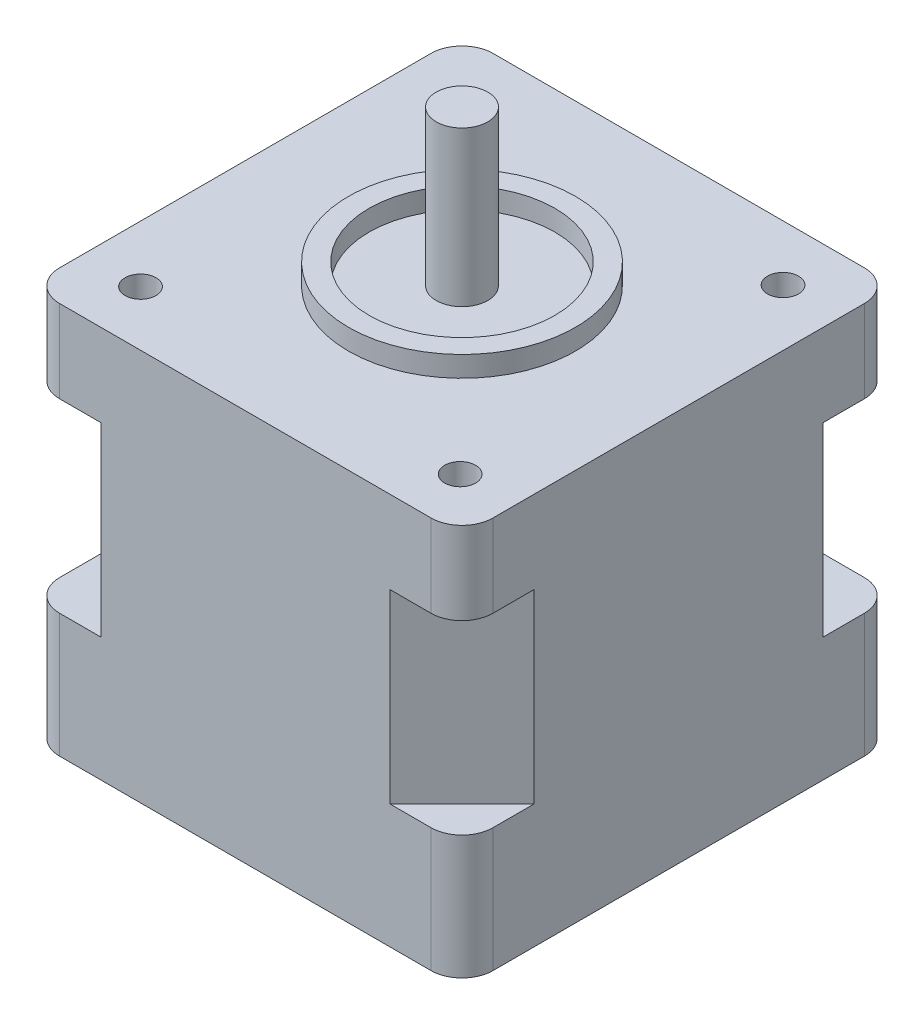
ISO-10303-21;
HEADER;
FILE_DESCRIPTION(('STEP AP214'),'2;1');
FILE_NAME('part.step','',(''),(''),'','','');
FILE_SCHEMA(('AUTOMOTIVE_DESIGN { 1 0 10303 214 1 1 1 1 }'));
ENDSEC;
DATA;
#1=APPLICATION_CONTEXT('core data for automotive mechanical design processes');
#2=APPLICATION_PROTOCOL_DEFINITION('international standard','automotive_design',2000,#1);
#3=PRODUCT_CONTEXT('',#1,'mechanical');
#4=PRODUCT('Part','Part','',(#3));
#5=PRODUCT_RELATED_PRODUCT_CATEGORY('part','',(#4));
#6=PRODUCT_DEFINITION_FORMATION('','',#4);
#7=PRODUCT_DEFINITION_CONTEXT('part definition',#1,'design');
#8=PRODUCT_DEFINITION('design','',#6,#7);
#9=PRODUCT_DEFINITION_SHAPE('','',#8);
#10=(LENGTH_UNIT() NAMED_UNIT(*) SI_UNIT(.MILLI.,.METRE.));
#11=(NAMED_UNIT(*) PLANE_ANGLE_UNIT() SI_UNIT($,.RADIAN.));
#12=(NAMED_UNIT(*) SI_UNIT($,.STERADIAN.) SOLID_ANGLE_UNIT());
#13=UNCERTAINTY_MEASURE_WITH_UNIT(LENGTH_MEASURE(1.E-05),#10,'distance_accuracy_value','');
#14=(GEOMETRIC_REPRESENTATION_CONTEXT(3) GLOBAL_UNCERTAINTY_ASSIGNED_CONTEXT((#13)) GLOBAL_UNIT_ASSIGNED_CONTEXT((#10,
#11,#12)) REPRESENTATION_CONTEXT('',''));
#15=CARTESIAN_POINT('',(0.,0.,0.));
#16=DIRECTION('',(0.,0.,1.));
#17=DIRECTION('',(1.,0.,0.));
#18=AXIS2_PLACEMENT_3D('',#15,#16,#17);
#19=CARTESIAN_POINT('',(-18.,12.,-21.));
#20=DIRECTION('',(0.,0.,1.));
#21=DIRECTION('',(1.,0.,0.));
#22=AXIS2_PLACEMENT_3D('',#19,#20,#21);
#23=PLANE('',#22);
#24=DIRECTION('',(-1.,0.,0.));
#25=VECTOR('',#24,1.);
#26=CARTESIAN_POINT('',(-18.,0.,-21.));
#27=LINE('',#26,#25);
#28=CARTESIAN_POINT('',(18.,0.,-21.));
#29=VERTEX_POINT('',#28);
#30=CARTESIAN_POINT('',(-18.,0.,-21.));
#31=VERTEX_POINT('',#30);
#32=EDGE_CURVE('E435',#29,#31,#27,.T.);
#33=ORIENTED_EDGE('',*,*,#32,.T.);
#34=DIRECTION('',(0.,-1.,0.));
#35=VECTOR('',#34,1.);
#36=CARTESIAN_POINT('',(-18.,12.,-21.));
#37=LINE('',#36,#35);
#38=CARTESIAN_POINT('',(-18.,12.,-21.));
#39=VERTEX_POINT('',#38);
#40=EDGE_CURVE('E445',#39,#31,#37,.T.);
#41=ORIENTED_EDGE('',*,*,#40,.F.);
#42=DIRECTION('',(-1.,0.,0.));
#43=VECTOR('',#42,1.);
#44=CARTESIAN_POINT('',(-18.,12.,-21.));
#45=LINE('',#44,#43);
#46=CARTESIAN_POINT('',(-14.,12.,-21.));
#47=VERTEX_POINT('',#46);
#48=EDGE_CURVE('E416',#47,#39,#45,.T.);
#49=ORIENTED_EDGE('',*,*,#48,.F.);
#50=DIRECTION('',(0.,-1.,0.));
#51=VECTOR('',#50,1.);
#52=CARTESIAN_POINT('',(-14.,30.,-21.));
#53=LINE('',#52,#51);
#54=CARTESIAN_POINT('',(-14.,30.,-21.));
#55=VERTEX_POINT('',#54);
#56=EDGE_CURVE('E398',#55,#47,#53,.T.);
#57=ORIENTED_EDGE('',*,*,#56,.F.);
#58=DIRECTION('',(-1.,0.,0.));
#59=VECTOR('',#58,1.);
#60=CARTESIAN_POINT('',(-18.,30.,-21.));
#61=LINE('',#60,#59);
#62=CARTESIAN_POINT('',(-18.,30.,-21.));
#63=VERTEX_POINT('',#62);
#64=EDGE_CURVE('E309',#55,#63,#61,.T.);
#65=ORIENTED_EDGE('',*,*,#64,.T.);
#66=DIRECTION('',(0.,-1.,0.));
#67=VECTOR('',#66,1.);
#68=CARTESIAN_POINT('',(-18.,38.,-21.));
#69=LINE('',#68,#67);
#70=CARTESIAN_POINT('',(-18.,38.,-21.));
#71=VERTEX_POINT('',#70);
#72=EDGE_CURVE('E347',#71,#63,#69,.T.);
#73=ORIENTED_EDGE('',*,*,#72,.F.);
#74=DIRECTION('',(-1.,0.,0.));
#75=VECTOR('',#74,1.);
#76=CARTESIAN_POINT('',(-18.,38.,-21.));
#77=LINE('',#76,#75);
#78=CARTESIAN_POINT('',(18.,38.,-21.));
#79=VERTEX_POINT('',#78);
#80=EDGE_CURVE('E291',#79,#71,#77,.T.);
#81=ORIENTED_EDGE('',*,*,#80,.F.);
#82=DIRECTION('',(0.,-1.,0.));
#83=VECTOR('',#82,1.);
#84=CARTESIAN_POINT('',(18.,38.,-21.));
#85=LINE('',#84,#83);
#86=CARTESIAN_POINT('',(18.,30.,-21.));
#87=VERTEX_POINT('',#86);
#88=EDGE_CURVE('E350',#79,#87,#85,.T.);
#89=ORIENTED_EDGE('',*,*,#88,.T.);
#90=CARTESIAN_POINT('',(14.,30.,-21.));
#91=VERTEX_POINT('',#90);
#92=EDGE_CURVE('E310',#87,#91,#61,.T.);
#93=ORIENTED_EDGE('',*,*,#92,.T.);
#94=DIRECTION('',(0.,-1.,0.));
#95=VECTOR('',#94,1.);
#96=CARTESIAN_POINT('',(14.,30.,-21.));
#97=LINE('',#96,#95);
#98=CARTESIAN_POINT('',(14.,12.,-21.));
#99=VERTEX_POINT('',#98);
#100=EDGE_CURVE('E367',#91,#99,#97,.T.);
#101=ORIENTED_EDGE('',*,*,#100,.T.);
#102=CARTESIAN_POINT('',(18.,12.,-21.));
#103=VERTEX_POINT('',#102);
#104=EDGE_CURVE('E417',#103,#99,#45,.T.);
#105=ORIENTED_EDGE('',*,*,#104,.F.);
#106=DIRECTION('',(0.,-1.,0.));
#107=VECTOR('',#106,1.);
#108=CARTESIAN_POINT('',(18.,12.,-21.));
#109=LINE('',#108,#107);
#110=EDGE_CURVE('E448',#103,#29,#109,.T.);
#111=ORIENTED_EDGE('',*,*,#110,.T.);
#112=EDGE_LOOP('',(#33,#41,#49,#57,#65,#73,#81,#89,#93,#101,#105,#111));
#113=FACE_BOUND('',#112,.T.);
#114=DIRECTION('',(0.,1.,0.));
#115=VECTOR('',#114,1.);
#116=CARTESIAN_POINT('',(-7.5,12.,-21.));
#117=LINE('',#116,#115);
#118=CARTESIAN_POINT('',(-7.5,7.,-21.));
#119=VERTEX_POINT('',#118);
#120=CARTESIAN_POINT('',(-7.5,12.,-21.));
#121=VERTEX_POINT('',#120);
#122=EDGE_CURVE('E242',#119,#121,#117,.T.);
#123=ORIENTED_EDGE('',*,*,#122,.F.);
#124=DIRECTION('',(-1.,0.,0.));
#125=VECTOR('',#124,1.);
#126=CARTESIAN_POINT('',(7.5,7.,-21.));
#127=LINE('',#126,#125);
#128=CARTESIAN_POINT('',(7.49999999999999,7.,-21.));
#129=VERTEX_POINT('',#128);
#130=EDGE_CURVE('E239',#129,#119,#127,.T.);
#131=ORIENTED_EDGE('',*,*,#130,.F.);
#132=DIRECTION('',(0.,-1.,0.));
#133=VECTOR('',#132,1.);
#134=CARTESIAN_POINT('',(7.5,12.,-21.));
#135=LINE('',#134,#133);
#136=CARTESIAN_POINT('',(7.5,12.,-21.));
#137=VERTEX_POINT('',#136);
#138=EDGE_CURVE('E57',#137,#129,#135,.T.);
#139=ORIENTED_EDGE('',*,*,#138,.F.);
#140=DIRECTION('',(1.,0.,0.));
#141=VECTOR('',#140,1.);
#142=CARTESIAN_POINT('',(7.5,12.,-21.));
#143=LINE('',#142,#141);
#144=EDGE_CURVE('E52',#121,#137,#143,.T.);
#145=ORIENTED_EDGE('',*,*,#144,.F.);
#146=EDGE_LOOP('',(#123,#131,#139,#145));
#147=FACE_BOUND('',#146,.T.);
#148=ADVANCED_FACE('F37',(#113,#147),#23,.F.);
#149=CARTESIAN_POINT('',(-18.,12.,18.));
#150=DIRECTION('',(0.,-1.,0.));
#151=DIRECTION('',(0.,0.,-1.));
#152=AXIS2_PLACEMENT_3D('',#149,#150,#151);
#153=PLANE('',#152);
#154=DIRECTION('',(-0.707106781186547,0.,-0.707106781186547));
#155=VECTOR('',#154,1.);
#156=CARTESIAN_POINT('',(14.,12.,-21.));
#157=LINE('',#156,#155);
#158=CARTESIAN_POINT('',(21.,12.,-14.));
#159=VERTEX_POINT('',#158);
#160=EDGE_CURVE('E358',#159,#99,#157,.T.);
#161=ORIENTED_EDGE('',*,*,#160,.F.);
#162=DIRECTION('',(0.,0.,-1.));
#163=VECTOR('',#162,1.);
#164=CARTESIAN_POINT('',(21.,12.,-18.));
#165=LINE('',#164,#163);
#166=CARTESIAN_POINT('',(21.,12.,-18.));
#167=VERTEX_POINT('',#166);
#168=EDGE_CURVE('E411',#159,#167,#165,.T.);
#169=ORIENTED_EDGE('',*,*,#168,.T.);
#170=CARTESIAN_POINT('',(18.,12.,-18.));
#171=DIRECTION('',(0.,1.,0.));
#172=DIRECTION('',(0.,0.,-1.));
#173=AXIS2_PLACEMENT_3D('',#170,#171,#172);
#174=CIRCLE('',#173,3.);
#175=EDGE_CURVE('E414',#167,#103,#174,.T.);
#176=ORIENTED_EDGE('',*,*,#175,.T.);
#177=ORIENTED_EDGE('',*,*,#104,.T.);
#178=EDGE_LOOP('',(#161,#169,#176,#177));
#179=FACE_BOUND('',#178,.T.);
#180=ADVANCED_FACE('F566',(#179),#153,.F.);
#181=DIRECTION('',(0.707106781186547,0.,-0.707106781186547));
#182=VECTOR('',#181,1.);
#183=CARTESIAN_POINT('',(21.,12.,14.));
#184=LINE('',#183,#182);
#185=CARTESIAN_POINT('',(14.,12.,21.));
#186=VERTEX_POINT('',#185);
#187=CARTESIAN_POINT('',(21.,12.,14.));
#188=VERTEX_POINT('',#187);
#189=EDGE_CURVE('E373',#186,#188,#184,.T.);
#190=ORIENTED_EDGE('',*,*,#189,.F.);
#191=DIRECTION('',(1.,0.,0.));
#192=VECTOR('',#191,1.);
#193=CARTESIAN_POINT('',(-18.,12.,21.));
#194=LINE('',#193,#192);
#195=CARTESIAN_POINT('',(18.,12.,21.));
#196=VERTEX_POINT('',#195);
#197=EDGE_CURVE('E405',#186,#196,#194,.T.);
#198=ORIENTED_EDGE('',*,*,#197,.T.);
#199=CARTESIAN_POINT('',(18.,12.,18.));
#200=DIRECTION('',(0.,1.,0.));
#201=DIRECTION('',(0.,0.,1.));
#202=AXIS2_PLACEMENT_3D('',#199,#200,#201);
#203=CIRCLE('',#202,3.);
#204=CARTESIAN_POINT('',(21.,12.,18.));
#205=VERTEX_POINT('',#204);
#206=EDGE_CURVE('E409',#196,#205,#203,.T.);
#207=ORIENTED_EDGE('',*,*,#206,.T.);
#208=EDGE_CURVE('E412',#205,#188,#165,.T.);
#209=ORIENTED_EDGE('',*,*,#208,.T.);
#210=EDGE_LOOP('',(#190,#198,#207,#209));
#211=FACE_BOUND('',#210,.T.);
#212=ADVANCED_FACE('F484',(#211),#153,.F.);
#213=DIRECTION('',(0.707106781186547,0.,0.707106781186547));
#214=VECTOR('',#213,1.);
#215=CARTESIAN_POINT('',(-21.,12.,14.));
#216=LINE('',#215,#214);
#217=CARTESIAN_POINT('',(-21.,12.,14.));
#218=VERTEX_POINT('',#217);
#219=CARTESIAN_POINT('',(-14.,12.,21.));
#220=VERTEX_POINT('',#219);
#221=EDGE_CURVE('E370',#218,#220,#216,.T.);
#222=ORIENTED_EDGE('',*,*,#221,.F.);
#223=DIRECTION('',(0.,0.,1.));
#224=VECTOR('',#223,1.);
#225=CARTESIAN_POINT('',(-21.,12.,-18.));
#226=LINE('',#225,#224);
#227=CARTESIAN_POINT('',(-21.,12.,18.));
#228=VERTEX_POINT('',#227);
#229=EDGE_CURVE('E421',#218,#228,#226,.T.);
#230=ORIENTED_EDGE('',*,*,#229,.T.);
#231=CARTESIAN_POINT('',(-18.,12.,18.));
#232=DIRECTION('',(0.,1.,0.));
#233=DIRECTION('',(0.,0.,-1.));
#234=AXIS2_PLACEMENT_3D('',#231,#232,#233);
#235=CIRCLE('',#234,3.);
#236=CARTESIAN_POINT('',(-18.,12.,21.));
#237=VERTEX_POINT('',#236);
#238=EDGE_CURVE('E402',#228,#237,#235,.T.);
#239=ORIENTED_EDGE('',*,*,#238,.T.);
#240=EDGE_CURVE('E407',#237,#220,#194,.T.);
#241=ORIENTED_EDGE('',*,*,#240,.T.);
#242=EDGE_LOOP('',(#222,#230,#239,#241));
#243=FACE_BOUND('',#242,.T.);
#244=ADVANCED_FACE('F519',(#243),#153,.F.);
#245=DIRECTION('',(-0.707106781186547,0.,0.707106781186547));
#246=VECTOR('',#245,1.);
#247=CARTESIAN_POINT('',(-21.,12.,-14.));
#248=LINE('',#247,#246);
#249=CARTESIAN_POINT('',(-21.,12.,-14.));
#250=VERTEX_POINT('',#249);
#251=EDGE_CURVE('E353',#47,#250,#248,.T.);
#252=ORIENTED_EDGE('',*,*,#251,.F.);
#253=ORIENTED_EDGE('',*,*,#48,.T.);
#254=CARTESIAN_POINT('',(-18.,12.,-18.));
#255=DIRECTION('',(0.,1.,0.));
#256=DIRECTION('',(0.,0.,-1.));
#257=AXIS2_PLACEMENT_3D('',#254,#255,#256);
#258=CIRCLE('',#257,3.);
#259=CARTESIAN_POINT('',(-21.,12.,-18.));
#260=VERTEX_POINT('',#259);
#261=EDGE_CURVE('E419',#39,#260,#258,.T.);
#262=ORIENTED_EDGE('',*,*,#261,.T.);
#263=EDGE_CURVE('E422',#260,#250,#226,.T.);
#264=ORIENTED_EDGE('',*,*,#263,.T.);
#265=EDGE_LOOP('',(#252,#253,#262,#264));
#266=FACE_BOUND('',#265,.T.);
#267=ADVANCED_FACE('F572',(#266),#153,.F.);
#268=CARTESIAN_POINT('',(-18.,12.,18.));
#269=DIRECTION('',(0.,-1.,0.));
#270=DIRECTION('',(0.,0.,-1.));
#271=AXIS2_PLACEMENT_3D('',#268,#269,#270);
#272=CYLINDRICAL_SURFACE('',#271,3.);
#273=CARTESIAN_POINT('',(-18.,0.,18.));
#274=DIRECTION('',(0.,1.,0.));
#275=DIRECTION('',(0.,0.,-1.));
#276=AXIS2_PLACEMENT_3D('',#273,#274,#275);
#277=CIRCLE('',#276,3.);
#278=CARTESIAN_POINT('',(-21.,0.,18.));
#279=VERTEX_POINT('',#278);
#280=CARTESIAN_POINT('',(-18.,0.,21.));
#281=VERTEX_POINT('',#280);
#282=EDGE_CURVE('E401',#279,#281,#277,.T.);
#283=ORIENTED_EDGE('',*,*,#282,.T.);
#284=DIRECTION('',(0.,-1.,0.));
#285=VECTOR('',#284,1.);
#286=CARTESIAN_POINT('',(-18.,12.,21.));
#287=LINE('',#286,#285);
#288=EDGE_CURVE('E45',#237,#281,#287,.T.);
#289=ORIENTED_EDGE('',*,*,#288,.F.);
#290=ORIENTED_EDGE('',*,*,#238,.F.);
#291=DIRECTION('',(0.,-1.,0.));
#292=VECTOR('',#291,1.);
#293=CARTESIAN_POINT('',(-21.,12.,18.));
#294=LINE('',#293,#292);
#295=EDGE_CURVE('E424',#228,#279,#294,.T.);
#296=ORIENTED_EDGE('',*,*,#295,.T.);
#297=EDGE_LOOP('',(#283,#289,#290,#296));
#298=FACE_BOUND('',#297,.T.);
#299=ADVANCED_FACE('F39',(#298),#272,.T.);
#300=CARTESIAN_POINT('',(-18.,12.,21.));
#301=DIRECTION('',(0.,0.,-1.));
#302=DIRECTION('',(-1.,0.,0.));
#303=AXIS2_PLACEMENT_3D('',#300,#301,#302);
#304=PLANE('',#303);
#305=DIRECTION('',(1.,0.,0.));
#306=VECTOR('',#305,1.);
#307=CARTESIAN_POINT('',(-18.,0.,21.));
#308=LINE('',#307,#306);
#309=CARTESIAN_POINT('',(18.,0.,21.));
#310=VERTEX_POINT('',#309);
#311=EDGE_CURVE('E427',#281,#310,#308,.T.);
#312=ORIENTED_EDGE('',*,*,#311,.T.);
#313=DIRECTION('',(0.,-1.,0.));
#314=VECTOR('',#313,1.);
#315=CARTESIAN_POINT('',(18.,12.,21.));
#316=LINE('',#315,#314);
#317=EDGE_CURVE('E457',#196,#310,#316,.T.);
#318=ORIENTED_EDGE('',*,*,#317,.F.);
#319=ORIENTED_EDGE('',*,*,#197,.F.);
#320=DIRECTION('',(0.,-1.,0.));
#321=VECTOR('',#320,1.);
#322=CARTESIAN_POINT('',(14.,30.,21.));
#323=LINE('',#322,#321);
#324=CARTESIAN_POINT('',(14.,30.,21.));
#325=VERTEX_POINT('',#324);
#326=EDGE_CURVE('E386',#325,#186,#323,.T.);
#327=ORIENTED_EDGE('',*,*,#326,.F.);
#328=DIRECTION('',(1.,0.,0.));
#329=VECTOR('',#328,1.);
#330=CARTESIAN_POINT('',(-18.,30.,21.));
#331=LINE('',#330,#329);
#332=CARTESIAN_POINT('',(18.,30.,21.));
#333=VERTEX_POINT('',#332);
#334=EDGE_CURVE('E321',#325,#333,#331,.T.);
#335=ORIENTED_EDGE('',*,*,#334,.T.);
#336=DIRECTION('',(0.,-1.,0.));
#337=VECTOR('',#336,1.);
#338=CARTESIAN_POINT('',(18.,38.,21.));
#339=LINE('',#338,#337);
#340=CARTESIAN_POINT('',(18.,38.,21.));
#341=VERTEX_POINT('',#340);
#342=EDGE_CURVE('E335',#341,#333,#339,.T.);
#343=ORIENTED_EDGE('',*,*,#342,.F.);
#344=DIRECTION('',(1.,0.,0.));
#345=VECTOR('',#344,1.);
#346=CARTESIAN_POINT('',(-18.,38.,21.));
#347=LINE('',#346,#345);
#348=CARTESIAN_POINT('',(-18.,38.,21.));
#349=VERTEX_POINT('',#348);
#350=EDGE_CURVE('E300',#349,#341,#347,.T.);
#351=ORIENTED_EDGE('',*,*,#350,.F.);
#352=DIRECTION('',(0.,-1.,0.));
#353=VECTOR('',#352,1.);
#354=CARTESIAN_POINT('',(-18.,38.,21.));
#355=LINE('',#354,#353);
#356=CARTESIAN_POINT('',(-18.,30.,21.));
#357=VERTEX_POINT('',#356);
#358=EDGE_CURVE('E338',#349,#357,#355,.T.);
#359=ORIENTED_EDGE('',*,*,#358,.T.);
#360=CARTESIAN_POINT('',(-14.,30.,21.));
#361=VERTEX_POINT('',#360);
#362=EDGE_CURVE('E322',#357,#361,#331,.T.);
#363=ORIENTED_EDGE('',*,*,#362,.T.);
#364=DIRECTION('',(0.,-1.,0.));
#365=VECTOR('',#364,1.);
#366=CARTESIAN_POINT('',(-14.,30.,21.));
#367=LINE('',#366,#365);
#368=EDGE_CURVE('E389',#361,#220,#367,.T.);
#369=ORIENTED_EDGE('',*,*,#368,.T.);
#370=ORIENTED_EDGE('',*,*,#240,.F.);
#371=ORIENTED_EDGE('',*,*,#288,.T.);
#372=EDGE_LOOP('',(#312,#318,#319,#327,#335,#343,#351,#359,#363,#369,#370,#371));
#373=FACE_BOUND('',#372,.T.);
#374=ADVANCED_FACE('F462',(#373),#304,.F.);
#375=CARTESIAN_POINT('',(18.,12.,18.));
#376=DIRECTION('',(0.,-1.,0.));
#377=DIRECTION('',(0.,0.,-1.));
#378=AXIS2_PLACEMENT_3D('',#375,#376,#377);
#379=CYLINDRICAL_SURFACE('',#378,3.);
#380=CARTESIAN_POINT('',(18.,0.,18.));
#381=DIRECTION('',(0.,1.,0.));
#382=DIRECTION('',(0.,0.,1.));
#383=AXIS2_PLACEMENT_3D('',#380,#381,#382);
#384=CIRCLE('',#383,3.);
#385=CARTESIAN_POINT('',(21.,0.,18.));
#386=VERTEX_POINT('',#385);
#387=EDGE_CURVE('E429',#310,#386,#384,.T.);
#388=ORIENTED_EDGE('',*,*,#387,.T.);
#389=DIRECTION('',(0.,-1.,0.));
#390=VECTOR('',#389,1.);
#391=CARTESIAN_POINT('',(21.,12.,18.));
#392=LINE('',#391,#390);
#393=EDGE_CURVE('E454',#205,#386,#392,.T.);
#394=ORIENTED_EDGE('',*,*,#393,.F.);
#395=ORIENTED_EDGE('',*,*,#206,.F.);
#396=ORIENTED_EDGE('',*,*,#317,.T.);
#397=EDGE_LOOP('',(#388,#394,#395,#396));
#398=FACE_BOUND('',#397,.T.);
#399=ADVANCED_FACE('F477',(#398),#379,.T.);
#400=CARTESIAN_POINT('',(21.,12.,-18.));
#401=DIRECTION('',(-1.,0.,0.));
#402=DIRECTION('',(0.,0.,1.));
#403=AXIS2_PLACEMENT_3D('',#400,#401,#402);
#404=PLANE('',#403);
#405=DIRECTION('',(0.,0.,-1.));
#406=VECTOR('',#405,1.);
#407=CARTESIAN_POINT('',(21.,0.,-18.));
#408=LINE('',#407,#406);
#409=CARTESIAN_POINT('',(21.,0.,-18.));
#410=VERTEX_POINT('',#409);
#411=EDGE_CURVE('E431',#386,#410,#408,.T.);
#412=ORIENTED_EDGE('',*,*,#411,.T.);
#413=DIRECTION('',(0.,-1.,0.));
#414=VECTOR('',#413,1.);
#415=CARTESIAN_POINT('',(21.,12.,-18.));
#416=LINE('',#415,#414);
#417=EDGE_CURVE('E451',#167,#410,#416,.T.);
#418=ORIENTED_EDGE('',*,*,#417,.F.);
#419=ORIENTED_EDGE('',*,*,#168,.F.);
#420=DIRECTION('',(0.,-1.,0.));
#421=VECTOR('',#420,1.);
#422=CARTESIAN_POINT('',(21.,30.,-14.));
#423=LINE('',#422,#421);
#424=CARTESIAN_POINT('',(21.,30.,-14.));
#425=VERTEX_POINT('',#424);
#426=EDGE_CURVE('E380',#425,#159,#423,.T.);
#427=ORIENTED_EDGE('',*,*,#426,.F.);
#428=DIRECTION('',(0.,0.,-1.));
#429=VECTOR('',#428,1.);
#430=CARTESIAN_POINT('',(21.,30.,-18.));
#431=LINE('',#430,#429);
#432=CARTESIAN_POINT('',(21.,30.,-18.));
#433=VERTEX_POINT('',#432);
#434=EDGE_CURVE('E327',#425,#433,#431,.T.);
#435=ORIENTED_EDGE('',*,*,#434,.T.);
#436=DIRECTION('',(0.,-1.,0.));
#437=VECTOR('',#436,1.);
#438=CARTESIAN_POINT('',(21.,38.,-18.));
#439=LINE('',#438,#437);
#440=CARTESIAN_POINT('',(21.,38.,-18.));
#441=VERTEX_POINT('',#440);
#442=EDGE_CURVE('E306',#441,#433,#439,.T.);
#443=ORIENTED_EDGE('',*,*,#442,.F.);
#444=DIRECTION('',(0.,0.,-1.));
#445=VECTOR('',#444,1.);
#446=CARTESIAN_POINT('',(21.,38.,-18.));
#447=LINE('',#446,#445);
#448=CARTESIAN_POINT('',(21.,38.,18.));
#449=VERTEX_POINT('',#448);
#450=EDGE_CURVE('E304',#449,#441,#447,.T.);
#451=ORIENTED_EDGE('',*,*,#450,.F.);
#452=DIRECTION('',(0.,-1.,0.));
#453=VECTOR('',#452,1.);
#454=CARTESIAN_POINT('',(21.,38.,18.));
#455=LINE('',#454,#453);
#456=CARTESIAN_POINT('',(21.,30.,18.));
#457=VERTEX_POINT('',#456);
#458=EDGE_CURVE('E332',#449,#457,#455,.T.);
#459=ORIENTED_EDGE('',*,*,#458,.T.);
#460=CARTESIAN_POINT('',(21.,30.,14.));
#461=VERTEX_POINT('',#460);
#462=EDGE_CURVE('E292',#457,#461,#431,.T.);
#463=ORIENTED_EDGE('',*,*,#462,.T.);
#464=DIRECTION('',(0.,-1.,0.));
#465=VECTOR('',#464,1.);
#466=CARTESIAN_POINT('',(21.,30.,14.));
#467=LINE('',#466,#465);
#468=EDGE_CURVE('E383',#461,#188,#467,.T.);
#469=ORIENTED_EDGE('',*,*,#468,.T.);
#470=ORIENTED_EDGE('',*,*,#208,.F.);
#471=ORIENTED_EDGE('',*,*,#393,.T.);
#472=EDGE_LOOP('',(#412,#418,#419,#427,#435,#443,#451,#459,#463,#469,#470,#471));
#473=FACE_BOUND('',#472,.T.);
#474=ADVANCED_FACE('F481',(#473),#404,.F.);
#475=CARTESIAN_POINT('',(18.,12.,-18.));
#476=DIRECTION('',(0.,-1.,0.));
#477=DIRECTION('',(0.,0.,-1.));
#478=AXIS2_PLACEMENT_3D('',#475,#476,#477);
#479=CYLINDRICAL_SURFACE('',#478,3.);
#480=CARTESIAN_POINT('',(18.,0.,-18.));
#481=DIRECTION('',(0.,1.,0.));
#482=DIRECTION('',(0.,0.,-1.));
#483=AXIS2_PLACEMENT_3D('',#480,#481,#482);
#484=CIRCLE('',#483,3.);
#485=EDGE_CURVE('E433',#410,#29,#484,.T.);
#486=ORIENTED_EDGE('',*,*,#485,.T.);
#487=ORIENTED_EDGE('',*,*,#110,.F.);
#488=ORIENTED_EDGE('',*,*,#175,.F.);
#489=ORIENTED_EDGE('',*,*,#417,.T.);
#490=EDGE_LOOP('',(#486,#487,#488,#489));
#491=FACE_BOUND('',#490,.T.);
#492=ADVANCED_FACE('F535',(#491),#479,.T.);
#493=CARTESIAN_POINT('',(-18.,12.,-18.));
#494=DIRECTION('',(0.,-1.,0.));
#495=DIRECTION('',(0.,0.,-1.));
#496=AXIS2_PLACEMENT_3D('',#493,#494,#495);
#497=CYLINDRICAL_SURFACE('',#496,3.);
#498=CARTESIAN_POINT('',(-18.,0.,-18.));
#499=DIRECTION('',(0.,1.,0.));
#500=DIRECTION('',(0.,0.,-1.));
#501=AXIS2_PLACEMENT_3D('',#498,#499,#500);
#502=CIRCLE('',#501,3.);
#503=CARTESIAN_POINT('',(-21.,0.,-18.));
#504=VERTEX_POINT('',#503);
#505=EDGE_CURVE('E437',#31,#504,#502,.T.);
#506=ORIENTED_EDGE('',*,*,#505,.T.);
#507=DIRECTION('',(0.,-1.,0.));
#508=VECTOR('',#507,1.);
#509=CARTESIAN_POINT('',(-21.,12.,-18.));
#510=LINE('',#509,#508);
#511=EDGE_CURVE('E442',#260,#504,#510,.T.);
#512=ORIENTED_EDGE('',*,*,#511,.F.);
#513=ORIENTED_EDGE('',*,*,#261,.F.);
#514=ORIENTED_EDGE('',*,*,#40,.T.);
#515=EDGE_LOOP('',(#506,#512,#513,#514));
#516=FACE_BOUND('',#515,.T.);
#517=ADVANCED_FACE('F526',(#516),#497,.T.);
#518=CARTESIAN_POINT('',(-21.,12.,-18.));
#519=DIRECTION('',(1.,0.,0.));
#520=DIRECTION('',(0.,0.,-1.));
#521=AXIS2_PLACEMENT_3D('',#518,#519,#520);
#522=PLANE('',#521);
#523=DIRECTION('',(0.,0.,1.));
#524=VECTOR('',#523,1.);
#525=CARTESIAN_POINT('',(-21.,0.,-18.));
#526=LINE('',#525,#524);
#527=EDGE_CURVE('E406',#504,#279,#526,.T.);
#528=ORIENTED_EDGE('',*,*,#527,.T.);
#529=ORIENTED_EDGE('',*,*,#295,.F.);
#530=ORIENTED_EDGE('',*,*,#229,.F.);
#531=DIRECTION('',(0.,-1.,0.));
#532=VECTOR('',#531,1.);
#533=CARTESIAN_POINT('',(-21.,30.,14.));
#534=LINE('',#533,#532);
#535=CARTESIAN_POINT('',(-21.,30.,14.));
#536=VERTEX_POINT('',#535);
#537=EDGE_CURVE('E392',#536,#218,#534,.T.);
#538=ORIENTED_EDGE('',*,*,#537,.F.);
#539=DIRECTION('',(0.,0.,1.));
#540=VECTOR('',#539,1.);
#541=CARTESIAN_POINT('',(-21.,30.,-18.));
#542=LINE('',#541,#540);
#543=CARTESIAN_POINT('',(-21.,30.,18.));
#544=VERTEX_POINT('',#543);
#545=EDGE_CURVE('E315',#536,#544,#542,.T.);
#546=ORIENTED_EDGE('',*,*,#545,.T.);
#547=DIRECTION('',(0.,-1.,0.));
#548=VECTOR('',#547,1.);
#549=CARTESIAN_POINT('',(-21.,38.,18.));
#550=LINE('',#549,#548);
#551=CARTESIAN_POINT('',(-21.,38.,18.));
#552=VERTEX_POINT('',#551);
#553=EDGE_CURVE('E341',#552,#544,#550,.T.);
#554=ORIENTED_EDGE('',*,*,#553,.F.);
#555=DIRECTION('',(0.,0.,1.));
#556=VECTOR('',#555,1.);
#557=CARTESIAN_POINT('',(-21.,38.,-18.));
#558=LINE('',#557,#556);
#559=CARTESIAN_POINT('',(-21.,38.,-18.));
#560=VERTEX_POINT('',#559);
#561=EDGE_CURVE('E296',#560,#552,#558,.T.);
#562=ORIENTED_EDGE('',*,*,#561,.F.);
#563=DIRECTION('',(0.,-1.,0.));
#564=VECTOR('',#563,1.);
#565=CARTESIAN_POINT('',(-21.,38.,-18.));
#566=LINE('',#565,#564);
#567=CARTESIAN_POINT('',(-21.,30.,-18.));
#568=VERTEX_POINT('',#567);
#569=EDGE_CURVE('E344',#560,#568,#566,.T.);
#570=ORIENTED_EDGE('',*,*,#569,.T.);
#571=CARTESIAN_POINT('',(-21.,30.,-14.));
#572=VERTEX_POINT('',#571);
#573=EDGE_CURVE('E316',#568,#572,#542,.T.);
#574=ORIENTED_EDGE('',*,*,#573,.T.);
#575=DIRECTION('',(0.,-1.,0.));
#576=VECTOR('',#575,1.);
#577=CARTESIAN_POINT('',(-21.,30.,-14.));
#578=LINE('',#577,#576);
#579=EDGE_CURVE('E395',#572,#250,#578,.T.);
#580=ORIENTED_EDGE('',*,*,#579,.T.);
#581=ORIENTED_EDGE('',*,*,#263,.F.);
#582=ORIENTED_EDGE('',*,*,#511,.T.);
#583=EDGE_LOOP('',(#528,#529,#530,#538,#546,#554,#562,#570,#574,#580,#581,#582));
#584=FACE_BOUND('',#583,.T.);
#585=ADVANCED_FACE('F521',(#584),#522,.F.);
#586=CARTESIAN_POINT('',(-18.,0.,18.));
#587=DIRECTION('',(0.,-1.,0.));
#588=DIRECTION('',(0.,0.,-1.));
#589=AXIS2_PLACEMENT_3D('',#586,#587,#588);
#590=PLANE('',#589);
#591=ORIENTED_EDGE('',*,*,#282,.F.);
#592=ORIENTED_EDGE('',*,*,#527,.F.);
#593=ORIENTED_EDGE('',*,*,#505,.F.);
#594=ORIENTED_EDGE('',*,*,#32,.F.);
#595=ORIENTED_EDGE('',*,*,#485,.F.);
#596=ORIENTED_EDGE('',*,*,#411,.F.);
#597=ORIENTED_EDGE('',*,*,#387,.F.);
#598=ORIENTED_EDGE('',*,*,#311,.F.);
#599=EDGE_LOOP('',(#591,#592,#593,#594,#595,#596,#597,#598));
#600=FACE_BOUND('',#599,.T.);
#601=ADVANCED_FACE('F470',(#600),#590,.T.);
#602=CARTESIAN_POINT('',(-21.,30.,-14.));
#603=DIRECTION('',(0.707106781186547,0.,0.707106781186547));
#604=DIRECTION('',(0.707106781186548,0.,-0.707106781186548));
#605=AXIS2_PLACEMENT_3D('',#602,#603,#604);
#606=PLANE('',#605);
#607=ORIENTED_EDGE('',*,*,#251,.T.);
#608=ORIENTED_EDGE('',*,*,#579,.F.);
#609=DIRECTION('',(-0.707106781186547,0.,0.707106781186547));
#610=VECTOR('',#609,1.);
#611=CARTESIAN_POINT('',(-21.,30.,-14.));
#612=LINE('',#611,#610);
#613=EDGE_CURVE('E354',#55,#572,#612,.T.);
#614=ORIENTED_EDGE('',*,*,#613,.F.);
#615=ORIENTED_EDGE('',*,*,#56,.T.);
#616=EDGE_LOOP('',(#607,#608,#614,#615));
#617=FACE_BOUND('',#616,.T.);
#618=ADVANCED_FACE('F594',(#617),#606,.F.);
#619=CARTESIAN_POINT('',(-21.,30.,14.));
#620=DIRECTION('',(0.707106781186547,0.,-0.707106781186547));
#621=DIRECTION('',(-0.707106781186548,0.,-0.707106781186548));
#622=AXIS2_PLACEMENT_3D('',#619,#620,#621);
#623=PLANE('',#622);
#624=ORIENTED_EDGE('',*,*,#221,.T.);
#625=ORIENTED_EDGE('',*,*,#368,.F.);
#626=DIRECTION('',(0.707106781186547,0.,0.707106781186547));
#627=VECTOR('',#626,1.);
#628=CARTESIAN_POINT('',(-21.,30.,14.));
#629=LINE('',#628,#627);
#630=EDGE_CURVE('E357',#536,#361,#629,.T.);
#631=ORIENTED_EDGE('',*,*,#630,.F.);
#632=ORIENTED_EDGE('',*,*,#537,.T.);
#633=EDGE_LOOP('',(#624,#625,#631,#632));
#634=FACE_BOUND('',#633,.T.);
#635=ADVANCED_FACE('F516',(#634),#623,.F.);
#636=CARTESIAN_POINT('',(21.,30.,14.));
#637=DIRECTION('',(-0.707106781186547,0.,-0.707106781186547));
#638=DIRECTION('',(-0.707106781186548,0.,0.707106781186548));
#639=AXIS2_PLACEMENT_3D('',#636,#637,#638);
#640=PLANE('',#639);
#641=ORIENTED_EDGE('',*,*,#189,.T.);
#642=ORIENTED_EDGE('',*,*,#468,.F.);
#643=DIRECTION('',(0.707106781186547,0.,-0.707106781186547));
#644=VECTOR('',#643,1.);
#645=CARTESIAN_POINT('',(21.,30.,14.));
#646=LINE('',#645,#644);
#647=EDGE_CURVE('E361',#325,#461,#646,.T.);
#648=ORIENTED_EDGE('',*,*,#647,.F.);
#649=ORIENTED_EDGE('',*,*,#326,.T.);
#650=EDGE_LOOP('',(#641,#642,#648,#649));
#651=FACE_BOUND('',#650,.T.);
#652=ADVANCED_FACE('F487',(#651),#640,.F.);
#653=CARTESIAN_POINT('',(14.,30.,-21.));
#654=DIRECTION('',(-0.707106781186547,0.,0.707106781186547));
#655=DIRECTION('',(0.707106781186548,0.,0.707106781186548));
#656=AXIS2_PLACEMENT_3D('',#653,#654,#655);
#657=PLANE('',#656);
#658=ORIENTED_EDGE('',*,*,#160,.T.);
#659=ORIENTED_EDGE('',*,*,#100,.F.);
#660=DIRECTION('',(-0.707106781186547,0.,-0.707106781186547));
#661=VECTOR('',#660,1.);
#662=CARTESIAN_POINT('',(14.,30.,-21.));
#663=LINE('',#662,#661);
#664=EDGE_CURVE('E364',#425,#91,#663,.T.);
#665=ORIENTED_EDGE('',*,*,#664,.F.);
#666=ORIENTED_EDGE('',*,*,#426,.T.);
#667=EDGE_LOOP('',(#658,#659,#665,#666));
#668=FACE_BOUND('',#667,.T.);
#669=ADVANCED_FACE('F540',(#668),#657,.F.);
#670=CARTESIAN_POINT('',(18.,30.,-18.));
#671=DIRECTION('',(0.,1.,0.));
#672=DIRECTION('',(0.,0.,1.));
#673=AXIS2_PLACEMENT_3D('',#670,#671,#672);
#674=PLANE('',#673);
#675=ORIENTED_EDGE('',*,*,#64,.F.);
#676=ORIENTED_EDGE('',*,*,#613,.T.);
#677=ORIENTED_EDGE('',*,*,#573,.F.);
#678=CARTESIAN_POINT('',(-18.,30.,-18.));
#679=DIRECTION('',(0.,1.,0.));
#680=DIRECTION('',(0.,0.,-1.));
#681=AXIS2_PLACEMENT_3D('',#678,#679,#680);
#682=CIRCLE('',#681,3.);
#683=EDGE_CURVE('E313',#63,#568,#682,.T.);
#684=ORIENTED_EDGE('',*,*,#683,.F.);
#685=EDGE_LOOP('',(#675,#676,#677,#684));
#686=FACE_BOUND('',#685,.T.);
#687=ADVANCED_FACE('F682',(#686),#674,.F.);
#688=ORIENTED_EDGE('',*,*,#545,.F.);
#689=ORIENTED_EDGE('',*,*,#630,.T.);
#690=ORIENTED_EDGE('',*,*,#362,.F.);
#691=CARTESIAN_POINT('',(-18.,30.,18.));
#692=DIRECTION('',(0.,1.,0.));
#693=DIRECTION('',(0.,0.,-1.));
#694=AXIS2_PLACEMENT_3D('',#691,#692,#693);
#695=CIRCLE('',#694,3.);
#696=EDGE_CURVE('E319',#544,#357,#695,.T.);
#697=ORIENTED_EDGE('',*,*,#696,.F.);
#698=EDGE_LOOP('',(#688,#689,#690,#697));
#699=FACE_BOUND('',#698,.T.);
#700=ADVANCED_FACE('F513',(#699),#674,.F.);
#701=ORIENTED_EDGE('',*,*,#334,.F.);
#702=ORIENTED_EDGE('',*,*,#647,.T.);
#703=ORIENTED_EDGE('',*,*,#462,.F.);
#704=CARTESIAN_POINT('',(18.,30.,18.));
#705=DIRECTION('',(0.,1.,0.));
#706=DIRECTION('',(0.,0.,1.));
#707=AXIS2_PLACEMENT_3D('',#704,#705,#706);
#708=CIRCLE('',#707,3.);
#709=EDGE_CURVE('E325',#333,#457,#708,.T.);
#710=ORIENTED_EDGE('',*,*,#709,.F.);
#711=EDGE_LOOP('',(#701,#702,#703,#710));
#712=FACE_BOUND('',#711,.T.);
#713=ADVANCED_FACE('F499',(#712),#674,.F.);
#714=ORIENTED_EDGE('',*,*,#434,.F.);
#715=ORIENTED_EDGE('',*,*,#664,.T.);
#716=ORIENTED_EDGE('',*,*,#92,.F.);
#717=CARTESIAN_POINT('',(18.,30.,-18.));
#718=DIRECTION('',(0.,1.,0.));
#719=DIRECTION('',(0.,0.,1.));
#720=AXIS2_PLACEMENT_3D('',#717,#718,#719);
#721=CIRCLE('',#720,3.);
#722=EDGE_CURVE('E285',#433,#87,#721,.T.);
#723=ORIENTED_EDGE('',*,*,#722,.F.);
#724=EDGE_LOOP('',(#714,#715,#716,#723));
#725=FACE_BOUND('',#724,.T.);
#726=ADVANCED_FACE('F544',(#725),#674,.F.);
#727=CARTESIAN_POINT('',(18.,38.,-18.));
#728=DIRECTION('',(0.,-1.,0.));
#729=DIRECTION('',(0.,0.,-1.));
#730=AXIS2_PLACEMENT_3D('',#727,#728,#729);
#731=CYLINDRICAL_SURFACE('',#730,3.);
#732=ORIENTED_EDGE('',*,*,#722,.T.);
#733=ORIENTED_EDGE('',*,*,#88,.F.);
#734=CARTESIAN_POINT('',(18.,38.,-18.));
#735=DIRECTION('',(0.,1.,0.));
#736=DIRECTION('',(0.,0.,1.));
#737=AXIS2_PLACEMENT_3D('',#734,#735,#736);
#738=CIRCLE('',#737,3.);
#739=EDGE_CURVE('E288',#441,#79,#738,.T.);
#740=ORIENTED_EDGE('',*,*,#739,.F.);
#741=ORIENTED_EDGE('',*,*,#442,.T.);
#742=EDGE_LOOP('',(#732,#733,#740,#741));
#743=FACE_BOUND('',#742,.T.);
#744=ADVANCED_FACE('F546',(#743),#731,.T.);
#745=CARTESIAN_POINT('',(-18.,38.,-18.));
#746=DIRECTION('',(0.,-1.,0.));
#747=DIRECTION('',(0.,0.,-1.));
#748=AXIS2_PLACEMENT_3D('',#745,#746,#747);
#749=CYLINDRICAL_SURFACE('',#748,3.);
#750=ORIENTED_EDGE('',*,*,#683,.T.);
#751=ORIENTED_EDGE('',*,*,#569,.F.);
#752=CARTESIAN_POINT('',(-18.,38.,-18.));
#753=DIRECTION('',(0.,1.,0.));
#754=DIRECTION('',(0.,0.,-1.));
#755=AXIS2_PLACEMENT_3D('',#752,#753,#754);
#756=CIRCLE('',#755,3.);
#757=EDGE_CURVE('E294',#71,#560,#756,.T.);
#758=ORIENTED_EDGE('',*,*,#757,.F.);
#759=ORIENTED_EDGE('',*,*,#72,.T.);
#760=EDGE_LOOP('',(#750,#751,#758,#759));
#761=FACE_BOUND('',#760,.T.);
#762=ADVANCED_FACE('F553',(#761),#749,.T.);
#763=CARTESIAN_POINT('',(-18.,38.,18.));
#764=DIRECTION('',(0.,-1.,0.));
#765=DIRECTION('',(0.,0.,-1.));
#766=AXIS2_PLACEMENT_3D('',#763,#764,#765);
#767=CYLINDRICAL_SURFACE('',#766,3.);
#768=ORIENTED_EDGE('',*,*,#696,.T.);
#769=ORIENTED_EDGE('',*,*,#358,.F.);
#770=CARTESIAN_POINT('',(-18.,38.,18.));
#771=DIRECTION('',(0.,1.,0.));
#772=DIRECTION('',(0.,0.,-1.));
#773=AXIS2_PLACEMENT_3D('',#770,#771,#772);
#774=CIRCLE('',#773,3.);
#775=EDGE_CURVE('E298',#552,#349,#774,.T.);
#776=ORIENTED_EDGE('',*,*,#775,.F.);
#777=ORIENTED_EDGE('',*,*,#553,.T.);
#778=EDGE_LOOP('',(#768,#769,#776,#777));
#779=FACE_BOUND('',#778,.T.);
#780=ADVANCED_FACE('F556',(#779),#767,.T.);
#781=CARTESIAN_POINT('',(18.,38.,18.));
#782=DIRECTION('',(0.,-1.,0.));
#783=DIRECTION('',(0.,0.,-1.));
#784=AXIS2_PLACEMENT_3D('',#781,#782,#783);
#785=CYLINDRICAL_SURFACE('',#784,3.);
#786=ORIENTED_EDGE('',*,*,#709,.T.);
#787=ORIENTED_EDGE('',*,*,#458,.F.);
#788=CARTESIAN_POINT('',(18.,38.,18.));
#789=DIRECTION('',(0.,1.,0.));
#790=DIRECTION('',(0.,0.,1.));
#791=AXIS2_PLACEMENT_3D('',#788,#789,#790);
#792=CIRCLE('',#791,3.);
#793=EDGE_CURVE('E302',#341,#449,#792,.T.);
#794=ORIENTED_EDGE('',*,*,#793,.F.);
#795=ORIENTED_EDGE('',*,*,#342,.T.);
#796=EDGE_LOOP('',(#786,#787,#794,#795));
#797=FACE_BOUND('',#796,.T.);
#798=ADVANCED_FACE('F496',(#797),#785,.T.);
#799=CARTESIAN_POINT('',(18.,38.,-18.));
#800=DIRECTION('',(0.,1.,0.));
#801=DIRECTION('',(0.,0.,1.));
#802=AXIS2_PLACEMENT_3D('',#799,#800,#801);
#803=PLANE('',#802);
#804=CARTESIAN_POINT('',(-15.494867745101,38.,15.6632366971436));
#805=DIRECTION('',(0.,1.,0.));
#806=DIRECTION('',(0.,0.,1.));
#807=AXIS2_PLACEMENT_3D('',#804,#805,#806);
#808=CIRCLE('',#807,1.5);
#809=CARTESIAN_POINT('',(-15.494867745101,38.,17.1632366971436));
#810=VERTEX_POINT('',#809);
#811=EDGE_CURVE('E243',#810,#810,#808,.T.);
#812=ORIENTED_EDGE('',*,*,#811,.F.);
#813=EDGE_LOOP('',(#812));
#814=FACE_BOUND('',#813,.T.);
#815=CARTESIAN_POINT('',(15.7326189706488,38.,15.9129315412443));
#816=DIRECTION('',(0.,1.,0.));
#817=DIRECTION('',(0.,0.,1.));
#818=AXIS2_PLACEMENT_3D('',#815,#816,#817);
#819=CIRCLE('',#818,1.5);
#820=CARTESIAN_POINT('',(15.7326189706488,38.,17.4129315412443));
#821=VERTEX_POINT('',#820);
#822=EDGE_CURVE('E262',#821,#821,#819,.T.);
#823=ORIENTED_EDGE('',*,*,#822,.F.);
#824=EDGE_LOOP('',(#823));
#825=FACE_BOUND('',#824,.T.);
#826=CARTESIAN_POINT('',(15.5055503305412,38.,-15.6114417600648));
#827=DIRECTION('',(0.,1.,0.));
#828=DIRECTION('',(0.,0.,1.));
#829=AXIS2_PLACEMENT_3D('',#826,#827,#828);
#830=CIRCLE('',#829,1.5);
#831=CARTESIAN_POINT('',(15.5055503305412,38.,-14.1114417600648));
#832=VERTEX_POINT('',#831);
#833=EDGE_CURVE('E256',#832,#832,#830,.T.);
#834=ORIENTED_EDGE('',*,*,#833,.F.);
#835=EDGE_LOOP('',(#834));
#836=FACE_BOUND('',#835,.T.);
#837=CARTESIAN_POINT('',(-15.5,38.,-15.5));
#838=DIRECTION('',(0.,1.,0.));
#839=DIRECTION('',(0.,0.,1.));
#840=AXIS2_PLACEMENT_3D('',#837,#838,#839);
#841=CIRCLE('',#840,1.5);
#842=CARTESIAN_POINT('',(-15.5,38.,-14.));
#843=VERTEX_POINT('',#842);
#844=EDGE_CURVE('E255',#843,#843,#841,.T.);
#845=ORIENTED_EDGE('',*,*,#844,.F.);
#846=EDGE_LOOP('',(#845));
#847=FACE_BOUND('',#846,.T.);
#848=CARTESIAN_POINT('',(0.,38.,0.));
#849=DIRECTION('',(0.,1.,0.));
#850=DIRECTION('',(0.,0.,1.));
#851=AXIS2_PLACEMENT_3D('',#848,#849,#850);
#852=CIRCLE('',#851,11.);
#853=CARTESIAN_POINT('',(0.,38.,11.));
#854=VERTEX_POINT('',#853);
#855=EDGE_CURVE('E281',#854,#854,#852,.T.);
#856=ORIENTED_EDGE('',*,*,#855,.F.);
#857=EDGE_LOOP('',(#856));
#858=FACE_BOUND('',#857,.T.);
#859=ORIENTED_EDGE('',*,*,#739,.T.);
#860=ORIENTED_EDGE('',*,*,#80,.T.);
#861=ORIENTED_EDGE('',*,*,#757,.T.);
#862=ORIENTED_EDGE('',*,*,#561,.T.);
#863=ORIENTED_EDGE('',*,*,#775,.T.);
#864=ORIENTED_EDGE('',*,*,#350,.T.);
#865=ORIENTED_EDGE('',*,*,#793,.T.);
#866=ORIENTED_EDGE('',*,*,#450,.T.);
#867=EDGE_LOOP('',(#859,#860,#861,#862,#863,#864,#865,#866));
#868=FACE_BOUND('',#867,.T.);
#869=ADVANCED_FACE('F504',(#814,#825,#836,#847,#858,#868),#803,.T.);
#870=CARTESIAN_POINT('',(0.,40.,0.));
#871=DIRECTION('',(0.,1.,0.));
#872=DIRECTION('',(0.,0.,1.));
#873=AXIS2_PLACEMENT_3D('',#870,#871,#872);
#874=PLANE('',#873);
#875=CARTESIAN_POINT('',(0.,40.,0.));
#876=DIRECTION('',(0.,1.,0.));
#877=DIRECTION('',(0.,0.,1.));
#878=AXIS2_PLACEMENT_3D('',#875,#876,#877);
#879=CIRCLE('',#878,11.);
#880=CARTESIAN_POINT('',(0.,40.,11.));
#881=VERTEX_POINT('',#880);
#882=EDGE_CURVE('E282',#881,#881,#879,.T.);
#883=ORIENTED_EDGE('',*,*,#882,.T.);
#884=EDGE_LOOP('',(#883));
#885=FACE_BOUND('',#884,.T.);
#886=CARTESIAN_POINT('',(0.,40.,0.));
#887=DIRECTION('',(0.,1.,0.));
#888=DIRECTION('',(0.,0.,1.));
#889=AXIS2_PLACEMENT_3D('',#886,#887,#888);
#890=CIRCLE('',#889,9.);
#891=CARTESIAN_POINT('',(0.,40.,9.));
#892=VERTEX_POINT('',#891);
#893=EDGE_CURVE('E276',#892,#892,#890,.T.);
#894=ORIENTED_EDGE('',*,*,#893,.F.);
#895=EDGE_LOOP('',(#894));
#896=FACE_BOUND('',#895,.T.);
#897=ADVANCED_FACE('F742',(#885,#896),#874,.T.);
#898=CARTESIAN_POINT('',(0.,40.,0.));
#899=DIRECTION('',(0.,-1.,0.));
#900=DIRECTION('',(0.,0.,-1.));
#901=AXIS2_PLACEMENT_3D('',#898,#899,#900);
#902=CYLINDRICAL_SURFACE('',#901,11.);
#903=ORIENTED_EDGE('',*,*,#882,.F.);
#904=EDGE_LOOP('',(#903));
#905=FACE_BOUND('',#904,.T.);
#906=ORIENTED_EDGE('',*,*,#855,.T.);
#907=EDGE_LOOP('',(#906));
#908=FACE_BOUND('',#907,.T.);
#909=ADVANCED_FACE('F747',(#905,#908),#902,.T.);
#910=CARTESIAN_POINT('',(0.,40.,0.));
#911=DIRECTION('',(0.,-1.,0.));
#912=DIRECTION('',(0.,0.,-1.));
#913=AXIS2_PLACEMENT_3D('',#910,#911,#912);
#914=CYLINDRICAL_SURFACE('',#913,9.);
#915=ORIENTED_EDGE('',*,*,#893,.T.);
#916=EDGE_LOOP('',(#915));
#917=FACE_BOUND('',#916,.T.);
#918=CARTESIAN_POINT('',(0.,38.,0.));
#919=DIRECTION('',(0.,1.,0.));
#920=DIRECTION('',(0.,0.,1.));
#921=AXIS2_PLACEMENT_3D('',#918,#919,#920);
#922=CIRCLE('',#921,9.);
#923=CARTESIAN_POINT('',(0.,38.,9.));
#924=VERTEX_POINT('',#923);
#925=EDGE_CURVE('E11',#924,#924,#922,.F.);
#926=ORIENTED_EDGE('',*,*,#925,.T.);
#927=EDGE_LOOP('',(#926));
#928=FACE_BOUND('',#927,.T.);
#929=ADVANCED_FACE('F758',(#917,#928),#914,.F.);
#930=CARTESIAN_POINT('',(0.,38.,0.));
#931=DIRECTION('',(0.,1.,0.));
#932=DIRECTION('',(0.,0.,1.));
#933=AXIS2_PLACEMENT_3D('',#930,#931,#932);
#934=CIRCLE('',#933,2.5);
#935=CARTESIAN_POINT('',(0.,38.,2.5));
#936=VERTEX_POINT('',#935);
#937=EDGE_CURVE('E270',#936,#936,#934,.T.);
#938=ORIENTED_EDGE('',*,*,#937,.F.);
#939=EDGE_LOOP('',(#938));
#940=FACE_BOUND('',#939,.T.);
#941=ORIENTED_EDGE('',*,*,#925,.F.);
#942=EDGE_LOOP('',(#941));
#943=FACE_BOUND('',#942,.T.);
#944=ADVANCED_FACE('F768',(#940,#943),#803,.T.);
#945=CARTESIAN_POINT('',(0.,53.,0.));
#946=DIRECTION('',(0.,-1.,0.));
#947=DIRECTION('',(0.,0.,-1.));
#948=AXIS2_PLACEMENT_3D('',#945,#946,#947);
#949=CYLINDRICAL_SURFACE('',#948,2.5);
#950=CARTESIAN_POINT('',(0.,53.,0.));
#951=DIRECTION('',(0.,1.,0.));
#952=DIRECTION('',(0.,0.,1.));
#953=AXIS2_PLACEMENT_3D('',#950,#951,#952);
#954=CIRCLE('',#953,2.5);
#955=CARTESIAN_POINT('',(0.,53.,2.5));
#956=VERTEX_POINT('',#955);
#957=EDGE_CURVE('E273',#956,#956,#954,.T.);
#958=ORIENTED_EDGE('',*,*,#957,.F.);
#959=EDGE_LOOP('',(#958));
#960=FACE_BOUND('',#959,.T.);
#961=ORIENTED_EDGE('',*,*,#937,.T.);
#962=EDGE_LOOP('',(#961));
#963=FACE_BOUND('',#962,.T.);
#964=ADVANCED_FACE('F778',(#960,#963),#949,.T.);
#965=CARTESIAN_POINT('',(0.,53.,0.));
#966=DIRECTION('',(0.,1.,0.));
#967=DIRECTION('',(0.,0.,1.));
#968=AXIS2_PLACEMENT_3D('',#965,#966,#967);
#969=PLANE('',#968);
#970=ORIENTED_EDGE('',*,*,#957,.T.);
#971=EDGE_LOOP('',(#970));
#972=FACE_BOUND('',#971,.T.);
#973=ADVANCED_FACE('F787',(#972),#969,.T.);
#974=CARTESIAN_POINT('',(-15.5,33.5,-15.5));
#975=DIRECTION('',(0.,1.,0.));
#976=DIRECTION('',(0.,0.,1.));
#977=AXIS2_PLACEMENT_3D('',#974,#975,#976);
#978=CYLINDRICAL_SURFACE('',#977,1.5);
#979=CARTESIAN_POINT('',(-15.5,33.5,-15.5));
#980=DIRECTION('',(0.,1.,0.));
#981=DIRECTION('',(0.,0.,1.));
#982=AXIS2_PLACEMENT_3D('',#979,#980,#981);
#983=CIRCLE('',#982,1.5);
#984=CARTESIAN_POINT('',(-15.5,33.5,-14.));
#985=VERTEX_POINT('',#984);
#986=EDGE_CURVE('E267',#985,#985,#983,.T.);
#987=ORIENTED_EDGE('',*,*,#986,.F.);
#988=EDGE_LOOP('',(#987));
#989=FACE_BOUND('',#988,.T.);
#990=ORIENTED_EDGE('',*,*,#844,.T.);
#991=EDGE_LOOP('',(#990));
#992=FACE_BOUND('',#991,.T.);
#993=ADVANCED_FACE('F797',(#989,#992),#978,.F.);
#994=CARTESIAN_POINT('',(-15.5,33.5,-15.5));
#995=DIRECTION('',(0.,1.,0.));
#996=DIRECTION('',(0.,0.,1.));
#997=AXIS2_PLACEMENT_3D('',#994,#995,#996);
#998=PLANE('',#997);
#999=ORIENTED_EDGE('',*,*,#986,.T.);
#1000=EDGE_LOOP('',(#999));
#1001=FACE_BOUND('',#1000,.T.);
#1002=ADVANCED_FACE('F813',(#1001),#998,.T.);
#1003=CARTESIAN_POINT('',(15.5055503305412,33.5,-15.6114417600648));
#1004=DIRECTION('',(0.,1.,0.));
#1005=DIRECTION('',(0.,0.,1.));
#1006=AXIS2_PLACEMENT_3D('',#1003,#1004,#1005);
#1007=CYLINDRICAL_SURFACE('',#1006,1.5);
#1008=CARTESIAN_POINT('',(15.5055503305412,33.5,-15.6114417600648));
#1009=DIRECTION('',(0.,1.,0.));
#1010=DIRECTION('',(0.,0.,1.));
#1011=AXIS2_PLACEMENT_3D('',#1008,#1009,#1010);
#1012=CIRCLE('',#1011,1.5);
#1013=CARTESIAN_POINT('',(15.5055503305412,33.5,-14.1114417600648));
#1014=VERTEX_POINT('',#1013);
#1015=EDGE_CURVE('E252',#1014,#1014,#1012,.T.);
#1016=ORIENTED_EDGE('',*,*,#1015,.F.);
#1017=EDGE_LOOP('',(#1016));
#1018=FACE_BOUND('',#1017,.T.);
#1019=ORIENTED_EDGE('',*,*,#833,.T.);
#1020=EDGE_LOOP('',(#1019));
#1021=FACE_BOUND('',#1020,.T.);
#1022=ADVANCED_FACE('F823',(#1018,#1021),#1007,.F.);
#1023=CARTESIAN_POINT('',(15.5055503305412,33.5,-15.6114417600648));
#1024=DIRECTION('',(0.,1.,0.));
#1025=DIRECTION('',(0.,0.,1.));
#1026=AXIS2_PLACEMENT_3D('',#1023,#1024,#1025);
#1027=PLANE('',#1026);
#1028=ORIENTED_EDGE('',*,*,#1015,.T.);
#1029=EDGE_LOOP('',(#1028));
#1030=FACE_BOUND('',#1029,.T.);
#1031=ADVANCED_FACE('F833',(#1030),#1027,.T.);
#1032=CARTESIAN_POINT('',(15.7326189706488,33.5,15.9129315412443));
#1033=DIRECTION('',(0.,1.,0.));
#1034=DIRECTION('',(0.,0.,1.));
#1035=AXIS2_PLACEMENT_3D('',#1032,#1033,#1034);
#1036=CYLINDRICAL_SURFACE('',#1035,1.5);
#1037=CARTESIAN_POINT('',(15.7326189706488,33.5,15.9129315412443));
#1038=DIRECTION('',(0.,1.,0.));
#1039=DIRECTION('',(0.,0.,1.));
#1040=AXIS2_PLACEMENT_3D('',#1037,#1038,#1039);
#1041=CIRCLE('',#1040,1.5);
#1042=CARTESIAN_POINT('',(15.7326189706488,33.5,17.4129315412443));
#1043=VERTEX_POINT('',#1042);
#1044=EDGE_CURVE('E259',#1043,#1043,#1041,.T.);
#1045=ORIENTED_EDGE('',*,*,#1044,.F.);
#1046=EDGE_LOOP('',(#1045));
#1047=FACE_BOUND('',#1046,.T.);
#1048=ORIENTED_EDGE('',*,*,#822,.T.);
#1049=EDGE_LOOP('',(#1048));
#1050=FACE_BOUND('',#1049,.T.);
#1051=ADVANCED_FACE('F843',(#1047,#1050),#1036,.F.);
#1052=CARTESIAN_POINT('',(15.7326189706488,33.5,15.9129315412443));
#1053=DIRECTION('',(0.,1.,0.));
#1054=DIRECTION('',(0.,0.,1.));
#1055=AXIS2_PLACEMENT_3D('',#1052,#1053,#1054);
#1056=PLANE('',#1055);
#1057=ORIENTED_EDGE('',*,*,#1044,.T.);
#1058=EDGE_LOOP('',(#1057));
#1059=FACE_BOUND('',#1058,.T.);
#1060=ADVANCED_FACE('F853',(#1059),#1056,.T.);
#1061=CARTESIAN_POINT('',(-15.494867745101,33.5,15.6632366971436));
#1062=DIRECTION('',(0.,1.,0.));
#1063=DIRECTION('',(0.,0.,1.));
#1064=AXIS2_PLACEMENT_3D('',#1061,#1062,#1063);
#1065=CYLINDRICAL_SURFACE('',#1064,1.5);
#1066=CARTESIAN_POINT('',(-15.494867745101,33.5,15.6632366971436));
#1067=DIRECTION('',(0.,1.,0.));
#1068=DIRECTION('',(0.,0.,1.));
#1069=AXIS2_PLACEMENT_3D('',#1066,#1067,#1068);
#1070=CIRCLE('',#1069,1.5);
#1071=CARTESIAN_POINT('',(-15.494867745101,33.5,17.1632366971436));
#1072=VERTEX_POINT('',#1071);
#1073=EDGE_CURVE('E246',#1072,#1072,#1070,.T.);
#1074=ORIENTED_EDGE('',*,*,#1073,.F.);
#1075=EDGE_LOOP('',(#1074));
#1076=FACE_BOUND('',#1075,.T.);
#1077=ORIENTED_EDGE('',*,*,#811,.T.);
#1078=EDGE_LOOP('',(#1077));
#1079=FACE_BOUND('',#1078,.T.);
#1080=ADVANCED_FACE('F863',(#1076,#1079),#1065,.F.);
#1081=CARTESIAN_POINT('',(-15.494867745101,33.5,15.6632366971436));
#1082=DIRECTION('',(0.,1.,0.));
#1083=DIRECTION('',(0.,0.,1.));
#1084=AXIS2_PLACEMENT_3D('',#1081,#1082,#1083);
#1085=PLANE('',#1084);
#1086=ORIENTED_EDGE('',*,*,#1073,.T.);
#1087=EDGE_LOOP('',(#1086));
#1088=FACE_BOUND('',#1087,.T.);
#1089=ADVANCED_FACE('F873',(#1088),#1085,.T.);
#1090=CARTESIAN_POINT('',(-7.5,12.,-26.));
#1091=DIRECTION('',(1.,0.,0.));
#1092=DIRECTION('',(0.,0.,-1.));
#1093=AXIS2_PLACEMENT_3D('',#1090,#1091,#1092);
#1094=PLANE('',#1093);
#1095=ORIENTED_EDGE('',*,*,#122,.T.);
#1096=DIRECTION('',(0.,0.,1.));
#1097=VECTOR('',#1096,1.);
#1098=CARTESIAN_POINT('',(-7.5,12.,-26.));
#1099=LINE('',#1098,#1097);
#1100=CARTESIAN_POINT('',(-7.5,12.,-26.));
#1101=VERTEX_POINT('',#1100);
#1102=EDGE_CURVE('E223',#1101,#121,#1099,.T.);
#1103=ORIENTED_EDGE('',*,*,#1102,.F.);
#1104=DIRECTION('',(0.,1.,0.));
#1105=VECTOR('',#1104,1.);
#1106=CARTESIAN_POINT('',(-7.5,12.,-26.));
#1107=LINE('',#1106,#1105);
#1108=CARTESIAN_POINT('',(-7.5,7.,-26.));
#1109=VERTEX_POINT('',#1108);
#1110=EDGE_CURVE('E230',#1109,#1101,#1107,.T.);
#1111=ORIENTED_EDGE('',*,*,#1110,.F.);
#1112=DIRECTION('',(0.,0.,1.));
#1113=VECTOR('',#1112,1.);
#1114=CARTESIAN_POINT('',(-7.5,7.,-26.));
#1115=LINE('',#1114,#1113);
#1116=EDGE_CURVE('E939',#1109,#119,#1115,.T.);
#1117=ORIENTED_EDGE('',*,*,#1116,.T.);
#1118=EDGE_LOOP('',(#1095,#1103,#1111,#1117));
#1119=FACE_BOUND('',#1118,.T.);
#1120=ADVANCED_FACE('F241',(#1119),#1094,.F.);
#1121=CARTESIAN_POINT('',(7.5,12.,-26.));
#1122=DIRECTION('',(0.,-1.,0.));
#1123=DIRECTION('',(0.,0.,-1.));
#1124=AXIS2_PLACEMENT_3D('',#1121,#1122,#1123);
#1125=PLANE('',#1124);
#1126=ORIENTED_EDGE('',*,*,#144,.T.);
#1127=DIRECTION('',(0.,0.,1.));
#1128=VECTOR('',#1127,1.);
#1129=CARTESIAN_POINT('',(7.5,12.,-26.));
#1130=LINE('',#1129,#1128);
#1131=CARTESIAN_POINT('',(7.5,12.,-26.));
#1132=VERTEX_POINT('',#1131);
#1133=EDGE_CURVE('E226',#1132,#137,#1130,.T.);
#1134=ORIENTED_EDGE('',*,*,#1133,.F.);
#1135=DIRECTION('',(1.,0.,0.));
#1136=VECTOR('',#1135,1.);
#1137=CARTESIAN_POINT('',(7.5,12.,-26.));
#1138=LINE('',#1137,#1136);
#1139=EDGE_CURVE('E219',#1101,#1132,#1138,.T.);
#1140=ORIENTED_EDGE('',*,*,#1139,.F.);
#1141=ORIENTED_EDGE('',*,*,#1102,.T.);
#1142=EDGE_LOOP('',(#1126,#1134,#1140,#1141));
#1143=FACE_BOUND('',#1142,.T.);
#1144=ADVANCED_FACE('F221',(#1143),#1125,.F.);
#1145=CARTESIAN_POINT('',(7.5,12.,-26.));
#1146=DIRECTION('',(-1.,0.,0.));
#1147=DIRECTION('',(0.,0.,1.));
#1148=AXIS2_PLACEMENT_3D('',#1145,#1146,#1147);
#1149=PLANE('',#1148);
#1150=ORIENTED_EDGE('',*,*,#138,.T.);
#1151=DIRECTION('',(0.,0.,1.));
#1152=VECTOR('',#1151,1.);
#1153=CARTESIAN_POINT('',(7.5,7.,-26.));
#1154=LINE('',#1153,#1152);
#1155=CARTESIAN_POINT('',(7.5,7.,-26.));
#1156=VERTEX_POINT('',#1155);
#1157=EDGE_CURVE('E248',#1156,#129,#1154,.T.);
#1158=ORIENTED_EDGE('',*,*,#1157,.F.);
#1159=DIRECTION('',(0.,-1.,0.));
#1160=VECTOR('',#1159,1.);
#1161=CARTESIAN_POINT('',(7.5,12.,-26.));
#1162=LINE('',#1161,#1160);
#1163=EDGE_CURVE('E229',#1132,#1156,#1162,.T.);
#1164=ORIENTED_EDGE('',*,*,#1163,.F.);
#1165=ORIENTED_EDGE('',*,*,#1133,.T.);
#1166=EDGE_LOOP('',(#1150,#1158,#1164,#1165));
#1167=FACE_BOUND('',#1166,.T.);
#1168=ADVANCED_FACE('F906',(#1167),#1149,.F.);
#1169=CARTESIAN_POINT('',(7.5,7.,-26.));
#1170=DIRECTION('',(0.,1.,0.));
#1171=DIRECTION('',(0.,0.,1.));
#1172=AXIS2_PLACEMENT_3D('',#1169,#1170,#1171);
#1173=PLANE('',#1172);
#1174=ORIENTED_EDGE('',*,*,#130,.T.);
#1175=ORIENTED_EDGE('',*,*,#1116,.F.);
#1176=DIRECTION('',(-1.,0.,0.));
#1177=VECTOR('',#1176,1.);
#1178=CARTESIAN_POINT('',(7.5,7.,-26.));
#1179=LINE('',#1178,#1177);
#1180=EDGE_CURVE('E235',#1156,#1109,#1179,.T.);
#1181=ORIENTED_EDGE('',*,*,#1180,.F.);
#1182=ORIENTED_EDGE('',*,*,#1157,.T.);
#1183=EDGE_LOOP('',(#1174,#1175,#1181,#1182));
#1184=FACE_BOUND('',#1183,.T.);
#1185=ADVANCED_FACE('F915',(#1184),#1173,.F.);
#1186=CARTESIAN_POINT('',(0.,0.,-26.));
#1187=DIRECTION('',(0.,0.,-1.));
#1188=DIRECTION('',(-1.,0.,0.));
#1189=AXIS2_PLACEMENT_3D('',#1186,#1187,#1188);
#1190=PLANE('',#1189);
#1191=ORIENTED_EDGE('',*,*,#1110,.T.);
#1192=ORIENTED_EDGE('',*,*,#1139,.T.);
#1193=ORIENTED_EDGE('',*,*,#1163,.T.);
#1194=ORIENTED_EDGE('',*,*,#1180,.T.);
#1195=EDGE_LOOP('',(#1191,#1192,#1193,#1194));
#1196=FACE_BOUND('',#1195,.T.);
#1197=ADVANCED_FACE('F233',(#1196),#1190,.T.);
#1198=CLOSED_SHELL('',(#148,#180,#212,#244,#267,#299,#374,#399,#474,#492,#517,#585,#601,#618,
#635,#652,#669,#687,#700,#713,#726,#744,#762,#780,#798,#869,#897,#909,#929,#944,#964,#973,#993,
#1002,#1022,#1031,#1051,#1060,#1080,#1089,#1120,#1144,#1168,#1185,#1197));
#1199=MANIFOLD_SOLID_BREP('B2',#1198);
#1200=ADVANCED_BREP_SHAPE_REPRESENTATION('',(#18,#1199),#14);
#1201=SHAPE_DEFINITION_REPRESENTATION(#9,#1200);
ENDSEC;
END-ISO-10303-21;
